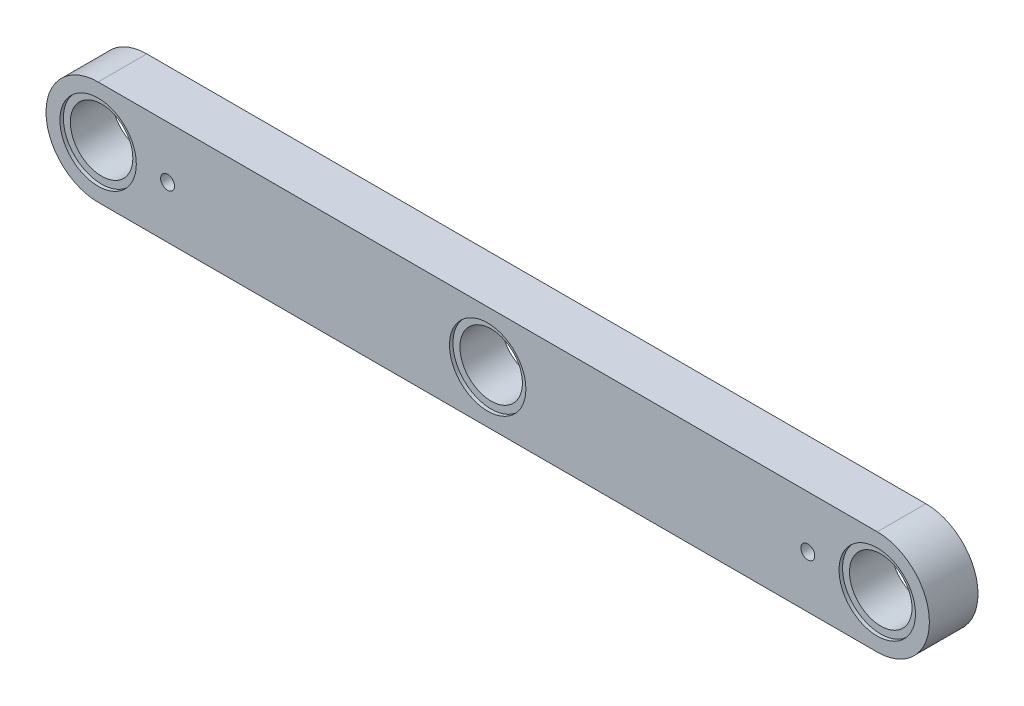
ISO-10303-21;
HEADER;
FILE_DESCRIPTION(('STEP AP214'),'2;1');
FILE_NAME('part.step','',(''),(''),'','','');
FILE_SCHEMA(('AUTOMOTIVE_DESIGN { 1 0 10303 214 1 1 1 1 }'));
ENDSEC;
DATA;
#1=APPLICATION_CONTEXT('core data for automotive mechanical design processes');
#2=APPLICATION_PROTOCOL_DEFINITION('international standard','automotive_design',2000,#1);
#3=PRODUCT_CONTEXT('',#1,'mechanical');
#4=PRODUCT('Part','Part','',(#3));
#5=PRODUCT_RELATED_PRODUCT_CATEGORY('part','',(#4));
#6=PRODUCT_DEFINITION_FORMATION('','',#4);
#7=PRODUCT_DEFINITION_CONTEXT('part definition',#1,'design');
#8=PRODUCT_DEFINITION('design','',#6,#7);
#9=PRODUCT_DEFINITION_SHAPE('','',#8);
#10=(LENGTH_UNIT() NAMED_UNIT(*) SI_UNIT(.MILLI.,.METRE.));
#11=(NAMED_UNIT(*) PLANE_ANGLE_UNIT() SI_UNIT($,.RADIAN.));
#12=(NAMED_UNIT(*) SI_UNIT($,.STERADIAN.) SOLID_ANGLE_UNIT());
#13=UNCERTAINTY_MEASURE_WITH_UNIT(LENGTH_MEASURE(1.E-05),#10,'distance_accuracy_value','');
#14=(GEOMETRIC_REPRESENTATION_CONTEXT(3) GLOBAL_UNCERTAINTY_ASSIGNED_CONTEXT((#13)) GLOBAL_UNIT_ASSIGNED_CONTEXT((#10,
#11,#12)) REPRESENTATION_CONTEXT('',''));
#15=CARTESIAN_POINT('',(0.,0.,0.));
#16=DIRECTION('',(0.,0.,1.));
#17=DIRECTION('',(1.,0.,0.));
#18=AXIS2_PLACEMENT_3D('',#15,#16,#17);
#19=CARTESIAN_POINT('',(-112.155,0.,7.));
#20=DIRECTION('',(0.,0.,-1.));
#21=DIRECTION('',(-1.,0.,0.));
#22=AXIS2_PLACEMENT_3D('',#19,#20,#21);
#23=CYLINDRICAL_SURFACE('',#22,11.);
#24=CARTESIAN_POINT('',(-112.155,0.,-7.));
#25=DIRECTION('',(0.,0.,1.));
#26=DIRECTION('',(1.,0.,0.));
#27=AXIS2_PLACEMENT_3D('',#24,#25,#26);
#28=CIRCLE('',#27,11.);
#29=CARTESIAN_POINT('',(-101.155,0.,-7.));
#30=VERTEX_POINT('',#29);
#31=EDGE_CURVE('E169',#30,#30,#28,.T.);
#32=ORIENTED_EDGE('',*,*,#31,.F.);
#33=EDGE_LOOP('',(#32));
#34=FACE_BOUND('',#33,.T.);
#35=CARTESIAN_POINT('',(-112.155,0.,-6.));
#36=DIRECTION('',(0.,0.,1.));
#37=DIRECTION('',(1.,0.,0.));
#38=AXIS2_PLACEMENT_3D('',#35,#36,#37);
#39=CIRCLE('',#38,11.);
#40=CARTESIAN_POINT('',(-101.155,0.,-6.));
#41=VERTEX_POINT('',#40);
#42=EDGE_CURVE('E221',#41,#41,#39,.T.);
#43=ORIENTED_EDGE('',*,*,#42,.T.);
#44=EDGE_LOOP('',(#43));
#45=FACE_BOUND('',#44,.T.);
#46=ADVANCED_FACE('F42',(#34,#45),#23,.F.);
#47=CARTESIAN_POINT('',(0.,0.,7.));
#48=DIRECTION('',(0.,0.,-1.));
#49=DIRECTION('',(-1.,0.,0.));
#50=AXIS2_PLACEMENT_3D('',#47,#48,#49);
#51=CYLINDRICAL_SURFACE('',#50,11.);
#52=CARTESIAN_POINT('',(0.,0.,-7.));
#53=DIRECTION('',(0.,0.,1.));
#54=DIRECTION('',(1.,0.,0.));
#55=AXIS2_PLACEMENT_3D('',#52,#53,#54);
#56=CIRCLE('',#55,11.);
#57=CARTESIAN_POINT('',(11.,0.,-7.));
#58=VERTEX_POINT('',#57);
#59=EDGE_CURVE('E153',#58,#58,#56,.T.);
#60=ORIENTED_EDGE('',*,*,#59,.F.);
#61=EDGE_LOOP('',(#60));
#62=FACE_BOUND('',#61,.T.);
#63=CARTESIAN_POINT('',(0.,0.,-6.));
#64=DIRECTION('',(0.,0.,1.));
#65=DIRECTION('',(1.,0.,0.));
#66=AXIS2_PLACEMENT_3D('',#63,#64,#65);
#67=CIRCLE('',#66,11.);
#68=CARTESIAN_POINT('',(11.,0.,-6.));
#69=VERTEX_POINT('',#68);
#70=EDGE_CURVE('E209',#69,#69,#67,.T.);
#71=ORIENTED_EDGE('',*,*,#70,.T.);
#72=EDGE_LOOP('',(#71));
#73=FACE_BOUND('',#72,.T.);
#74=ADVANCED_FACE('F149',(#62,#73),#51,.F.);
#75=CARTESIAN_POINT('',(112.155,0.,7.));
#76=DIRECTION('',(0.,0.,-1.));
#77=DIRECTION('',(-1.,0.,0.));
#78=AXIS2_PLACEMENT_3D('',#75,#76,#77);
#79=CYLINDRICAL_SURFACE('',#78,11.);
#80=CARTESIAN_POINT('',(112.155,0.,-7.));
#81=DIRECTION('',(0.,0.,1.));
#82=DIRECTION('',(1.,0.,0.));
#83=AXIS2_PLACEMENT_3D('',#80,#81,#82);
#84=CIRCLE('',#83,11.);
#85=CARTESIAN_POINT('',(123.155,0.,-7.));
#86=VERTEX_POINT('',#85);
#87=EDGE_CURVE('E160',#86,#86,#84,.T.);
#88=ORIENTED_EDGE('',*,*,#87,.F.);
#89=EDGE_LOOP('',(#88));
#90=FACE_BOUND('',#89,.T.);
#91=CARTESIAN_POINT('',(112.155,0.,-6.));
#92=DIRECTION('',(0.,0.,1.));
#93=DIRECTION('',(1.,0.,0.));
#94=AXIS2_PLACEMENT_3D('',#91,#92,#93);
#95=CIRCLE('',#94,11.);
#96=CARTESIAN_POINT('',(123.155,0.,-6.));
#97=VERTEX_POINT('',#96);
#98=EDGE_CURVE('E189',#97,#97,#95,.T.);
#99=ORIENTED_EDGE('',*,*,#98,.T.);
#100=EDGE_LOOP('',(#99));
#101=FACE_BOUND('',#100,.T.);
#102=ADVANCED_FACE('F252',(#90,#101),#79,.F.);
#103=CARTESIAN_POINT('',(112.155,0.,7.));
#104=DIRECTION('',(0.,0.,1.));
#105=DIRECTION('',(1.,0.,0.));
#106=AXIS2_PLACEMENT_3D('',#103,#104,#105);
#107=PLANE('',#106);
#108=CARTESIAN_POINT('',(-92.155,0.,7.));
#109=DIRECTION('',(0.,0.,1.));
#110=DIRECTION('',(1.,0.,0.));
#111=AXIS2_PLACEMENT_3D('',#108,#109,#110);
#112=CIRCLE('',#111,2.);
#113=CARTESIAN_POINT('',(-90.155,0.,7.));
#114=VERTEX_POINT('',#113);
#115=EDGE_CURVE('E173',#114,#114,#112,.T.);
#116=ORIENTED_EDGE('',*,*,#115,.F.);
#117=EDGE_LOOP('',(#116));
#118=FACE_BOUND('',#117,.T.);
#119=CARTESIAN_POINT('',(112.155,0.,7.));
#120=DIRECTION('',(0.,0.,1.));
#121=DIRECTION('',(1.,0.,0.));
#122=AXIS2_PLACEMENT_3D('',#119,#120,#121);
#123=CIRCLE('',#122,11.);
#124=CARTESIAN_POINT('',(123.155,0.,7.));
#125=VERTEX_POINT('',#124);
#126=EDGE_CURVE('E157',#125,#125,#123,.T.);
#127=ORIENTED_EDGE('',*,*,#126,.F.);
#128=EDGE_LOOP('',(#127));
#129=FACE_BOUND('',#128,.T.);
#130=CARTESIAN_POINT('',(112.155,0.,7.));
#131=DIRECTION('',(0.,0.,1.));
#132=DIRECTION('',(1.,0.,0.));
#133=AXIS2_PLACEMENT_3D('',#130,#131,#132);
#134=CIRCLE('',#133,15.);
#135=CARTESIAN_POINT('',(112.155,-14.9999999999999,7.));
#136=VERTEX_POINT('',#135);
#137=CARTESIAN_POINT('',(112.155,15.,7.));
#138=VERTEX_POINT('',#137);
#139=EDGE_CURVE('E97',#136,#138,#134,.T.);
#140=ORIENTED_EDGE('',*,*,#139,.T.);
#141=DIRECTION('',(-1.,0.,0.));
#142=VECTOR('',#141,1.);
#143=CARTESIAN_POINT('',(112.155,15.,7.));
#144=LINE('',#143,#142);
#145=CARTESIAN_POINT('',(-112.155,15.,7.));
#146=VERTEX_POINT('',#145);
#147=EDGE_CURVE('E91',#138,#146,#144,.T.);
#148=ORIENTED_EDGE('',*,*,#147,.T.);
#149=CARTESIAN_POINT('',(-112.155,0.,7.));
#150=DIRECTION('',(0.,0.,1.));
#151=DIRECTION('',(1.,0.,0.));
#152=AXIS2_PLACEMENT_3D('',#149,#150,#151);
#153=CIRCLE('',#152,15.);
#154=CARTESIAN_POINT('',(-112.155,-15.,7.));
#155=VERTEX_POINT('',#154);
#156=EDGE_CURVE('E95',#146,#155,#153,.T.);
#157=ORIENTED_EDGE('',*,*,#156,.T.);
#158=DIRECTION('',(1.,0.,0.));
#159=VECTOR('',#158,1.);
#160=CARTESIAN_POINT('',(112.155,-14.9999999999999,7.));
#161=LINE('',#160,#159);
#162=EDGE_CURVE('E60',#155,#136,#161,.T.);
#163=ORIENTED_EDGE('',*,*,#162,.T.);
#164=EDGE_LOOP('',(#140,#148,#157,#163));
#165=FACE_BOUND('',#164,.T.);
#166=CARTESIAN_POINT('',(0.,0.,7.));
#167=DIRECTION('',(0.,0.,1.));
#168=DIRECTION('',(1.,0.,0.));
#169=AXIS2_PLACEMENT_3D('',#166,#167,#168);
#170=CIRCLE('',#169,11.);
#171=CARTESIAN_POINT('',(11.,0.,7.));
#172=VERTEX_POINT('',#171);
#173=EDGE_CURVE('E120',#172,#172,#170,.T.);
#174=ORIENTED_EDGE('',*,*,#173,.F.);
#175=EDGE_LOOP('',(#174));
#176=FACE_BOUND('',#175,.T.);
#177=CARTESIAN_POINT('',(-112.155,0.,7.));
#178=DIRECTION('',(0.,0.,1.));
#179=DIRECTION('',(1.,0.,0.));
#180=AXIS2_PLACEMENT_3D('',#177,#178,#179);
#181=CIRCLE('',#180,11.);
#182=CARTESIAN_POINT('',(-101.155,0.,7.));
#183=VERTEX_POINT('',#182);
#184=EDGE_CURVE('E165',#183,#183,#181,.T.);
#185=ORIENTED_EDGE('',*,*,#184,.F.);
#186=EDGE_LOOP('',(#185));
#187=FACE_BOUND('',#186,.T.);
#188=CARTESIAN_POINT('',(92.155,0.,7.));
#189=DIRECTION('',(0.,0.,1.));
#190=DIRECTION('',(1.,0.,0.));
#191=AXIS2_PLACEMENT_3D('',#188,#189,#190);
#192=CIRCLE('',#191,2.);
#193=CARTESIAN_POINT('',(94.155,0.,7.));
#194=VERTEX_POINT('',#193);
#195=EDGE_CURVE('E181',#194,#194,#192,.T.);
#196=ORIENTED_EDGE('',*,*,#195,.F.);
#197=EDGE_LOOP('',(#196));
#198=FACE_BOUND('',#197,.T.);
#199=ADVANCED_FACE('F92',(#118,#129,#165,#176,#187,#198),#107,.T.);
#200=CARTESIAN_POINT('',(112.155,0.,-7.));
#201=DIRECTION('',(0.,0.,1.));
#202=DIRECTION('',(1.,0.,0.));
#203=AXIS2_PLACEMENT_3D('',#200,#201,#202);
#204=PLANE('',#203);
#205=CARTESIAN_POINT('',(112.155,0.,-7.));
#206=DIRECTION('',(0.,0.,1.));
#207=DIRECTION('',(1.,0.,0.));
#208=AXIS2_PLACEMENT_3D('',#205,#206,#207);
#209=CIRCLE('',#208,15.);
#210=CARTESIAN_POINT('',(112.155,-14.9999999999999,-7.));
#211=VERTEX_POINT('',#210);
#212=CARTESIAN_POINT('',(112.155,15.,-7.));
#213=VERTEX_POINT('',#212);
#214=EDGE_CURVE('E116',#211,#213,#209,.T.);
#215=ORIENTED_EDGE('',*,*,#214,.F.);
#216=DIRECTION('',(1.,0.,0.));
#217=VECTOR('',#216,1.);
#218=CARTESIAN_POINT('',(112.155,-14.9999999999999,-7.));
#219=LINE('',#218,#217);
#220=CARTESIAN_POINT('',(-112.155,-15.,-7.));
#221=VERTEX_POINT('',#220);
#222=EDGE_CURVE('E83',#221,#211,#219,.T.);
#223=ORIENTED_EDGE('',*,*,#222,.F.);
#224=CARTESIAN_POINT('',(-112.155,0.,-7.));
#225=DIRECTION('',(0.,0.,1.));
#226=DIRECTION('',(1.,0.,0.));
#227=AXIS2_PLACEMENT_3D('',#224,#225,#226);
#228=CIRCLE('',#227,15.);
#229=CARTESIAN_POINT('',(-112.155,15.,-7.));
#230=VERTEX_POINT('',#229);
#231=EDGE_CURVE('E77',#230,#221,#228,.T.);
#232=ORIENTED_EDGE('',*,*,#231,.F.);
#233=DIRECTION('',(-1.,0.,0.));
#234=VECTOR('',#233,1.);
#235=CARTESIAN_POINT('',(112.155,15.,-7.));
#236=LINE('',#235,#234);
#237=EDGE_CURVE('E103',#213,#230,#236,.T.);
#238=ORIENTED_EDGE('',*,*,#237,.F.);
#239=EDGE_LOOP('',(#215,#223,#232,#238));
#240=FACE_BOUND('',#239,.T.);
#241=ORIENTED_EDGE('',*,*,#59,.T.);
#242=EDGE_LOOP('',(#241));
#243=FACE_BOUND('',#242,.T.);
#244=ORIENTED_EDGE('',*,*,#87,.T.);
#245=EDGE_LOOP('',(#244));
#246=FACE_BOUND('',#245,.T.);
#247=ORIENTED_EDGE('',*,*,#31,.T.);
#248=EDGE_LOOP('',(#247));
#249=FACE_BOUND('',#248,.T.);
#250=CARTESIAN_POINT('',(-92.155,0.,-7.));
#251=DIRECTION('',(0.,0.,1.));
#252=DIRECTION('',(1.,0.,0.));
#253=AXIS2_PLACEMENT_3D('',#250,#251,#252);
#254=CIRCLE('',#253,2.);
#255=CARTESIAN_POINT('',(-90.155,0.,-7.));
#256=VERTEX_POINT('',#255);
#257=EDGE_CURVE('E177',#256,#256,#254,.T.);
#258=ORIENTED_EDGE('',*,*,#257,.T.);
#259=EDGE_LOOP('',(#258));
#260=FACE_BOUND('',#259,.T.);
#261=CARTESIAN_POINT('',(92.155,0.,-7.));
#262=DIRECTION('',(0.,0.,1.));
#263=DIRECTION('',(1.,0.,0.));
#264=AXIS2_PLACEMENT_3D('',#261,#262,#263);
#265=CIRCLE('',#264,2.);
#266=CARTESIAN_POINT('',(94.155,0.,-7.));
#267=VERTEX_POINT('',#266);
#268=EDGE_CURVE('E185',#267,#267,#265,.T.);
#269=ORIENTED_EDGE('',*,*,#268,.T.);
#270=EDGE_LOOP('',(#269));
#271=FACE_BOUND('',#270,.T.);
#272=ADVANCED_FACE('F273',(#240,#243,#246,#249,#260,#271),#204,.F.);
#273=CARTESIAN_POINT('',(112.155,0.,7.));
#274=DIRECTION('',(0.,0.,-1.));
#275=DIRECTION('',(-1.,0.,0.));
#276=AXIS2_PLACEMENT_3D('',#273,#274,#275);
#277=CYLINDRICAL_SURFACE('',#276,15.);
#278=ORIENTED_EDGE('',*,*,#214,.T.);
#279=DIRECTION('',(0.,0.,-1.));
#280=VECTOR('',#279,1.);
#281=CARTESIAN_POINT('',(112.155,15.,7.));
#282=LINE('',#281,#280);
#283=EDGE_CURVE('E105',#138,#213,#282,.T.);
#284=ORIENTED_EDGE('',*,*,#283,.F.);
#285=ORIENTED_EDGE('',*,*,#139,.F.);
#286=DIRECTION('',(0.,0.,-1.));
#287=VECTOR('',#286,1.);
#288=CARTESIAN_POINT('',(112.155,-14.9999999999999,7.));
#289=LINE('',#288,#287);
#290=EDGE_CURVE('E112',#136,#211,#289,.T.);
#291=ORIENTED_EDGE('',*,*,#290,.T.);
#292=EDGE_LOOP('',(#278,#284,#285,#291));
#293=FACE_BOUND('',#292,.T.);
#294=ADVANCED_FACE('F44',(#293),#277,.T.);
#295=CARTESIAN_POINT('',(112.155,15.,7.));
#296=DIRECTION('',(0.,-1.,0.));
#297=DIRECTION('',(1.,0.,0.));
#298=AXIS2_PLACEMENT_3D('',#295,#296,#297);
#299=PLANE('',#298);
#300=ORIENTED_EDGE('',*,*,#237,.T.);
#301=DIRECTION('',(0.,0.,-1.));
#302=VECTOR('',#301,1.);
#303=CARTESIAN_POINT('',(-112.155,15.,7.));
#304=LINE('',#303,#302);
#305=EDGE_CURVE('E101',#146,#230,#304,.T.);
#306=ORIENTED_EDGE('',*,*,#305,.F.);
#307=ORIENTED_EDGE('',*,*,#147,.F.);
#308=ORIENTED_EDGE('',*,*,#283,.T.);
#309=EDGE_LOOP('',(#300,#306,#307,#308));
#310=FACE_BOUND('',#309,.T.);
#311=ADVANCED_FACE('F102',(#310),#299,.F.);
#312=CARTESIAN_POINT('',(-112.155,0.,7.));
#313=DIRECTION('',(0.,0.,-1.));
#314=DIRECTION('',(-1.,0.,0.));
#315=AXIS2_PLACEMENT_3D('',#312,#313,#314);
#316=CYLINDRICAL_SURFACE('',#315,15.);
#317=ORIENTED_EDGE('',*,*,#231,.T.);
#318=DIRECTION('',(0.,0.,-1.));
#319=VECTOR('',#318,1.);
#320=CARTESIAN_POINT('',(-112.155,-15.,7.));
#321=LINE('',#320,#319);
#322=EDGE_CURVE('E106',#155,#221,#321,.T.);
#323=ORIENTED_EDGE('',*,*,#322,.F.);
#324=ORIENTED_EDGE('',*,*,#156,.F.);
#325=ORIENTED_EDGE('',*,*,#305,.T.);
#326=EDGE_LOOP('',(#317,#323,#324,#325));
#327=FACE_BOUND('',#326,.T.);
#328=ADVANCED_FACE('F108',(#327),#316,.T.);
#329=CARTESIAN_POINT('',(112.155,-14.9999999999999,7.));
#330=DIRECTION('',(0.,1.,0.));
#331=DIRECTION('',(-1.,0.,0.));
#332=AXIS2_PLACEMENT_3D('',#329,#330,#331);
#333=PLANE('',#332);
#334=ORIENTED_EDGE('',*,*,#222,.T.);
#335=ORIENTED_EDGE('',*,*,#290,.F.);
#336=ORIENTED_EDGE('',*,*,#162,.F.);
#337=ORIENTED_EDGE('',*,*,#322,.T.);
#338=EDGE_LOOP('',(#334,#335,#336,#337));
#339=FACE_BOUND('',#338,.T.);
#340=ADVANCED_FACE('F147',(#339),#333,.F.);
#341=CARTESIAN_POINT('',(0.,0.,6.));
#342=DIRECTION('',(0.,0.,1.));
#343=DIRECTION('',(1.,0.,0.));
#344=AXIS2_PLACEMENT_3D('',#341,#342,#343);
#345=CIRCLE('',#344,11.);
#346=CARTESIAN_POINT('',(11.,0.,6.));
#347=VERTEX_POINT('',#346);
#348=EDGE_CURVE('E52',#347,#347,#345,.T.);
#349=ORIENTED_EDGE('',*,*,#348,.F.);
#350=EDGE_LOOP('',(#349));
#351=FACE_BOUND('',#350,.T.);
#352=ORIENTED_EDGE('',*,*,#173,.T.);
#353=EDGE_LOOP('',(#352));
#354=FACE_BOUND('',#353,.T.);
#355=ADVANCED_FACE('F143',(#351,#354),#51,.F.);
#356=CARTESIAN_POINT('',(112.155,0.,6.));
#357=DIRECTION('',(0.,0.,1.));
#358=DIRECTION('',(1.,0.,0.));
#359=AXIS2_PLACEMENT_3D('',#356,#357,#358);
#360=CIRCLE('',#359,11.);
#361=CARTESIAN_POINT('',(123.155,0.,6.));
#362=VERTEX_POINT('',#361);
#363=EDGE_CURVE('E133',#362,#362,#360,.T.);
#364=ORIENTED_EDGE('',*,*,#363,.F.);
#365=EDGE_LOOP('',(#364));
#366=FACE_BOUND('',#365,.T.);
#367=ORIENTED_EDGE('',*,*,#126,.T.);
#368=EDGE_LOOP('',(#367));
#369=FACE_BOUND('',#368,.T.);
#370=ADVANCED_FACE('F146',(#366,#369),#79,.F.);
#371=CARTESIAN_POINT('',(-112.155,0.,6.));
#372=DIRECTION('',(0.,0.,1.));
#373=DIRECTION('',(1.,0.,0.));
#374=AXIS2_PLACEMENT_3D('',#371,#372,#373);
#375=CIRCLE('',#374,11.);
#376=CARTESIAN_POINT('',(-101.155,0.,6.));
#377=VERTEX_POINT('',#376);
#378=EDGE_CURVE('E11',#377,#377,#375,.T.);
#379=ORIENTED_EDGE('',*,*,#378,.F.);
#380=EDGE_LOOP('',(#379));
#381=FACE_BOUND('',#380,.T.);
#382=ORIENTED_EDGE('',*,*,#184,.T.);
#383=EDGE_LOOP('',(#382));
#384=FACE_BOUND('',#383,.T.);
#385=ADVANCED_FACE('F248',(#381,#384),#23,.F.);
#386=CARTESIAN_POINT('',(-92.155,0.,7.));
#387=DIRECTION('',(0.,0.,-1.));
#388=DIRECTION('',(-1.,0.,0.));
#389=AXIS2_PLACEMENT_3D('',#386,#387,#388);
#390=CYLINDRICAL_SURFACE('',#389,2.);
#391=ORIENTED_EDGE('',*,*,#115,.T.);
#392=EDGE_LOOP('',(#391));
#393=FACE_BOUND('',#392,.T.);
#394=ORIENTED_EDGE('',*,*,#257,.F.);
#395=EDGE_LOOP('',(#394));
#396=FACE_BOUND('',#395,.T.);
#397=ADVANCED_FACE('F258',(#393,#396),#390,.F.);
#398=CARTESIAN_POINT('',(92.155,0.,7.));
#399=DIRECTION('',(0.,0.,-1.));
#400=DIRECTION('',(-1.,0.,0.));
#401=AXIS2_PLACEMENT_3D('',#398,#399,#400);
#402=CYLINDRICAL_SURFACE('',#401,2.);
#403=ORIENTED_EDGE('',*,*,#195,.T.);
#404=EDGE_LOOP('',(#403));
#405=FACE_BOUND('',#404,.T.);
#406=ORIENTED_EDGE('',*,*,#268,.F.);
#407=EDGE_LOOP('',(#406));
#408=FACE_BOUND('',#407,.T.);
#409=ADVANCED_FACE('F264',(#405,#408),#402,.F.);
#410=CARTESIAN_POINT('',(112.155,0.,6.));
#411=DIRECTION('',(0.,0.,1.));
#412=DIRECTION('',(1.,0.,0.));
#413=AXIS2_PLACEMENT_3D('',#410,#411,#412);
#414=PLANE('',#413);
#415=ORIENTED_EDGE('',*,*,#363,.T.);
#416=EDGE_LOOP('',(#415));
#417=FACE_BOUND('',#416,.T.);
#418=CARTESIAN_POINT('',(112.155,0.,6.));
#419=DIRECTION('',(0.,0.,1.));
#420=DIRECTION('',(1.,0.,0.));
#421=AXIS2_PLACEMENT_3D('',#418,#419,#420);
#422=CIRCLE('',#421,9.);
#423=CARTESIAN_POINT('',(121.155,0.,6.));
#424=VERTEX_POINT('',#423);
#425=EDGE_CURVE('E196',#424,#424,#422,.T.);
#426=ORIENTED_EDGE('',*,*,#425,.F.);
#427=EDGE_LOOP('',(#426));
#428=FACE_BOUND('',#427,.T.);
#429=ADVANCED_FACE('F280',(#417,#428),#414,.T.);
#430=CARTESIAN_POINT('',(112.155,0.,-6.));
#431=DIRECTION('',(0.,0.,1.));
#432=DIRECTION('',(1.,0.,0.));
#433=AXIS2_PLACEMENT_3D('',#430,#431,#432);
#434=PLANE('',#433);
#435=ORIENTED_EDGE('',*,*,#98,.F.);
#436=EDGE_LOOP('',(#435));
#437=FACE_BOUND('',#436,.T.);
#438=CARTESIAN_POINT('',(112.155,0.,-6.));
#439=DIRECTION('',(0.,0.,1.));
#440=DIRECTION('',(1.,0.,0.));
#441=AXIS2_PLACEMENT_3D('',#438,#439,#440);
#442=CIRCLE('',#441,9.);
#443=CARTESIAN_POINT('',(121.155,0.,-6.));
#444=VERTEX_POINT('',#443);
#445=EDGE_CURVE('E197',#444,#444,#442,.T.);
#446=ORIENTED_EDGE('',*,*,#445,.T.);
#447=EDGE_LOOP('',(#446));
#448=FACE_BOUND('',#447,.T.);
#449=ADVANCED_FACE('F336',(#437,#448),#434,.F.);
#450=CARTESIAN_POINT('',(112.155,0.,6.));
#451=DIRECTION('',(0.,0.,-1.));
#452=DIRECTION('',(-1.,0.,0.));
#453=AXIS2_PLACEMENT_3D('',#450,#451,#452);
#454=CYLINDRICAL_SURFACE('',#453,9.);
#455=ORIENTED_EDGE('',*,*,#425,.T.);
#456=EDGE_LOOP('',(#455));
#457=FACE_BOUND('',#456,.T.);
#458=ORIENTED_EDGE('',*,*,#445,.F.);
#459=EDGE_LOOP('',(#458));
#460=FACE_BOUND('',#459,.T.);
#461=ADVANCED_FACE('F348',(#457,#460),#454,.F.);
#462=CARTESIAN_POINT('',(0.,0.,6.));
#463=DIRECTION('',(0.,0.,1.));
#464=DIRECTION('',(1.,0.,0.));
#465=AXIS2_PLACEMENT_3D('',#462,#463,#464);
#466=PLANE('',#465);
#467=ORIENTED_EDGE('',*,*,#348,.T.);
#468=EDGE_LOOP('',(#467));
#469=FACE_BOUND('',#468,.T.);
#470=CARTESIAN_POINT('',(0.,0.,6.));
#471=DIRECTION('',(0.,0.,1.));
#472=DIRECTION('',(1.,0.,0.));
#473=AXIS2_PLACEMENT_3D('',#470,#471,#472);
#474=CIRCLE('',#473,9.);
#475=CARTESIAN_POINT('',(9.,0.,6.));
#476=VERTEX_POINT('',#475);
#477=EDGE_CURVE('E205',#476,#476,#474,.T.);
#478=ORIENTED_EDGE('',*,*,#477,.F.);
#479=EDGE_LOOP('',(#478));
#480=FACE_BOUND('',#479,.T.);
#481=ADVANCED_FACE('F140',(#469,#480),#466,.T.);
#482=CARTESIAN_POINT('',(0.,0.,-6.));
#483=DIRECTION('',(0.,0.,1.));
#484=DIRECTION('',(1.,0.,0.));
#485=AXIS2_PLACEMENT_3D('',#482,#483,#484);
#486=PLANE('',#485);
#487=ORIENTED_EDGE('',*,*,#70,.F.);
#488=EDGE_LOOP('',(#487));
#489=FACE_BOUND('',#488,.T.);
#490=CARTESIAN_POINT('',(0.,0.,-6.));
#491=DIRECTION('',(0.,0.,1.));
#492=DIRECTION('',(1.,0.,0.));
#493=AXIS2_PLACEMENT_3D('',#490,#491,#492);
#494=CIRCLE('',#493,9.);
#495=CARTESIAN_POINT('',(9.,0.,-6.));
#496=VERTEX_POINT('',#495);
#497=EDGE_CURVE('E201',#496,#496,#494,.T.);
#498=ORIENTED_EDGE('',*,*,#497,.T.);
#499=EDGE_LOOP('',(#498));
#500=FACE_BOUND('',#499,.T.);
#501=ADVANCED_FACE('F369',(#489,#500),#486,.F.);
#502=CARTESIAN_POINT('',(0.,0.,6.));
#503=DIRECTION('',(0.,0.,-1.));
#504=DIRECTION('',(-1.,0.,0.));
#505=AXIS2_PLACEMENT_3D('',#502,#503,#504);
#506=CYLINDRICAL_SURFACE('',#505,9.);
#507=ORIENTED_EDGE('',*,*,#477,.T.);
#508=EDGE_LOOP('',(#507));
#509=FACE_BOUND('',#508,.T.);
#510=ORIENTED_EDGE('',*,*,#497,.F.);
#511=EDGE_LOOP('',(#510));
#512=FACE_BOUND('',#511,.T.);
#513=ADVANCED_FACE('F379',(#509,#512),#506,.F.);
#514=CARTESIAN_POINT('',(-112.155,0.,6.));
#515=DIRECTION('',(0.,0.,1.));
#516=DIRECTION('',(1.,0.,0.));
#517=AXIS2_PLACEMENT_3D('',#514,#515,#516);
#518=PLANE('',#517);
#519=ORIENTED_EDGE('',*,*,#378,.T.);
#520=EDGE_LOOP('',(#519));
#521=FACE_BOUND('',#520,.T.);
#522=CARTESIAN_POINT('',(-112.155,0.,6.));
#523=DIRECTION('',(0.,0.,1.));
#524=DIRECTION('',(1.,0.,0.));
#525=AXIS2_PLACEMENT_3D('',#522,#523,#524);
#526=CIRCLE('',#525,9.);
#527=CARTESIAN_POINT('',(-103.155,0.,6.));
#528=VERTEX_POINT('',#527);
#529=EDGE_CURVE('E217',#528,#528,#526,.T.);
#530=ORIENTED_EDGE('',*,*,#529,.F.);
#531=EDGE_LOOP('',(#530));
#532=FACE_BOUND('',#531,.T.);
#533=ADVANCED_FACE('F234',(#521,#532),#518,.T.);
#534=CARTESIAN_POINT('',(-112.155,0.,-6.));
#535=DIRECTION('',(0.,0.,1.));
#536=DIRECTION('',(1.,0.,0.));
#537=AXIS2_PLACEMENT_3D('',#534,#535,#536);
#538=PLANE('',#537);
#539=ORIENTED_EDGE('',*,*,#42,.F.);
#540=EDGE_LOOP('',(#539));
#541=FACE_BOUND('',#540,.T.);
#542=CARTESIAN_POINT('',(-112.155,0.,-6.));
#543=DIRECTION('',(0.,0.,1.));
#544=DIRECTION('',(1.,0.,0.));
#545=AXIS2_PLACEMENT_3D('',#542,#543,#544);
#546=CIRCLE('',#545,9.);
#547=CARTESIAN_POINT('',(-103.155,0.,-6.));
#548=VERTEX_POINT('',#547);
#549=EDGE_CURVE('E216',#548,#548,#546,.T.);
#550=ORIENTED_EDGE('',*,*,#549,.T.);
#551=EDGE_LOOP('',(#550));
#552=FACE_BOUND('',#551,.T.);
#553=ADVANCED_FACE('F230',(#541,#552),#538,.F.);
#554=CARTESIAN_POINT('',(-112.155,0.,6.));
#555=DIRECTION('',(0.,0.,-1.));
#556=DIRECTION('',(-1.,0.,0.));
#557=AXIS2_PLACEMENT_3D('',#554,#555,#556);
#558=CYLINDRICAL_SURFACE('',#557,9.);
#559=ORIENTED_EDGE('',*,*,#529,.T.);
#560=EDGE_LOOP('',(#559));
#561=FACE_BOUND('',#560,.T.);
#562=ORIENTED_EDGE('',*,*,#549,.F.);
#563=EDGE_LOOP('',(#562));
#564=FACE_BOUND('',#563,.T.);
#565=ADVANCED_FACE('F233',(#561,#564),#558,.F.);
#566=CLOSED_SHELL('',(#46,#74,#102,#199,#272,#294,#311,#328,#340,#355,#370,#385,#397,#409,#429,
#449,#461,#481,#501,#513,#533,#553,#565));
#567=MANIFOLD_SOLID_BREP('B2',#566);
#568=ADVANCED_BREP_SHAPE_REPRESENTATION('',(#18,#567),#14);
#569=SHAPE_DEFINITION_REPRESENTATION(#9,#568);
ENDSEC;
END-ISO-10303-21;
